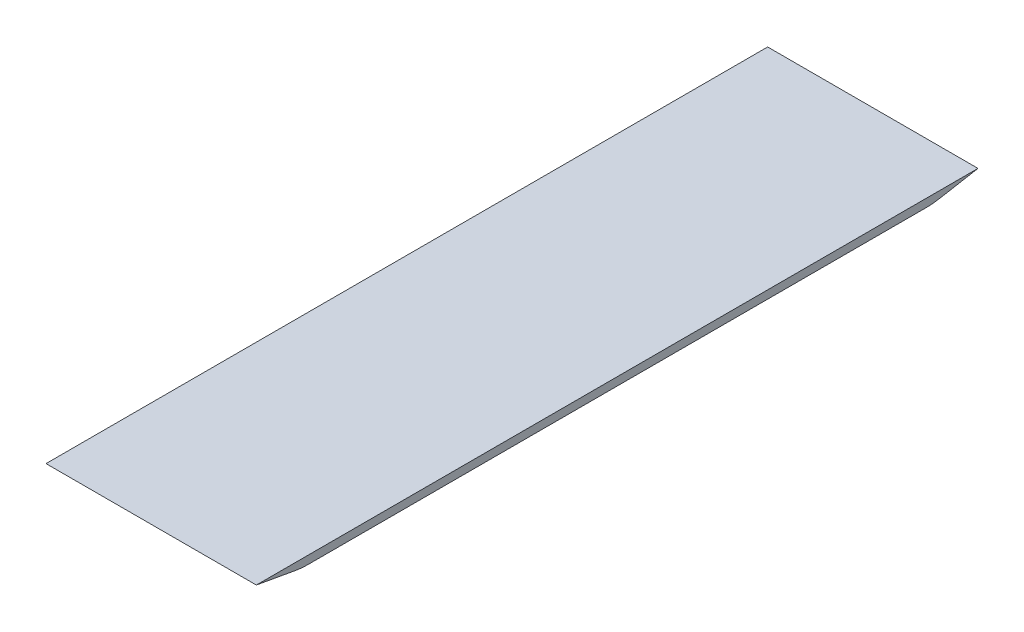
ISO-10303-21;
HEADER;
FILE_DESCRIPTION(('STEP AP214'),'2;1');
FILE_NAME('part.step','',(''),(''),'','','');
FILE_SCHEMA(('AUTOMOTIVE_DESIGN { 1 0 10303 214 1 1 1 1 }'));
ENDSEC;
DATA;
#1=APPLICATION_CONTEXT('core data for automotive mechanical design processes');
#2=APPLICATION_PROTOCOL_DEFINITION('international standard','automotive_design',2000,#1);
#3=PRODUCT_CONTEXT('',#1,'mechanical');
#4=PRODUCT('Part','Part','',(#3));
#5=PRODUCT_RELATED_PRODUCT_CATEGORY('part','',(#4));
#6=PRODUCT_DEFINITION_FORMATION('','',#4);
#7=PRODUCT_DEFINITION_CONTEXT('part definition',#1,'design');
#8=PRODUCT_DEFINITION('design','',#6,#7);
#9=PRODUCT_DEFINITION_SHAPE('','',#8);
#10=(LENGTH_UNIT() NAMED_UNIT(*) SI_UNIT(.MILLI.,.METRE.));
#11=(NAMED_UNIT(*) PLANE_ANGLE_UNIT() SI_UNIT($,.RADIAN.));
#12=(NAMED_UNIT(*) SI_UNIT($,.STERADIAN.) SOLID_ANGLE_UNIT());
#13=UNCERTAINTY_MEASURE_WITH_UNIT(LENGTH_MEASURE(1.E-05),#10,'distance_accuracy_value','');
#14=(GEOMETRIC_REPRESENTATION_CONTEXT(3) GLOBAL_UNCERTAINTY_ASSIGNED_CONTEXT((#13)) GLOBAL_UNIT_ASSIGNED_CONTEXT((#10,
#11,#12)) REPRESENTATION_CONTEXT('',''));
#15=CARTESIAN_POINT('',(0.,0.,0.));
#16=DIRECTION('',(0.,0.,1.));
#17=DIRECTION('',(1.,0.,0.));
#18=AXIS2_PLACEMENT_3D('',#15,#16,#17);
#19=CARTESIAN_POINT('',(130.,0.,-446.));
#20=DIRECTION('',(0.,-0.984427575508482,-0.175790638483657));
#21=DIRECTION('',(0.,0.175790638483657,-0.984427575508482));
#22=AXIS2_PLACEMENT_3D('',#19,#20,#21);
#23=PLANE('',#22);
#24=DIRECTION('',(0.,-0.175790638483657,0.984427575508482));
#25=VECTOR('',#24,1.);
#26=CARTESIAN_POINT('',(130.,0.,-446.));
#27=LINE('',#26,#25);
#28=CARTESIAN_POINT('',(130.,0.,-446.));
#29=VERTEX_POINT('',#28);
#30=CARTESIAN_POINT('',(130.,-4.22137877542409,-422.360278857625));
#31=VERTEX_POINT('',#30);
#32=EDGE_CURVE('E109',#29,#31,#27,.T.);
#33=ORIENTED_EDGE('',*,*,#32,.T.);
#34=DIRECTION('',(-1.,0.,0.));
#35=VECTOR('',#34,1.);
#36=CARTESIAN_POINT('',(130.,-4.22137877542409,-422.360278857625));
#37=LINE('',#36,#35);
#38=CARTESIAN_POINT('',(0.,-4.22137877542409,-422.360278857625));
#39=VERTEX_POINT('',#38);
#40=EDGE_CURVE('E122',#31,#39,#37,.T.);
#41=ORIENTED_EDGE('',*,*,#40,.T.);
#42=DIRECTION('',(0.,-0.175790638483657,0.984427575508482));
#43=VECTOR('',#42,1.);
#44=CARTESIAN_POINT('',(0.,0.,-446.));
#45=LINE('',#44,#43);
#46=CARTESIAN_POINT('',(0.,0.,-446.));
#47=VERTEX_POINT('',#46);
#48=EDGE_CURVE('E113',#47,#39,#45,.T.);
#49=ORIENTED_EDGE('',*,*,#48,.F.);
#50=DIRECTION('',(-1.,0.,0.));
#51=VECTOR('',#50,1.);
#52=CARTESIAN_POINT('',(130.,0.,-446.));
#53=LINE('',#52,#51);
#54=EDGE_CURVE('E104',#29,#47,#53,.T.);
#55=ORIENTED_EDGE('',*,*,#54,.F.);
#56=EDGE_LOOP('',(#33,#41,#49,#55));
#57=FACE_BOUND('',#56,.T.);
#58=ADVANCED_FACE('F39',(#57),#23,.T.);
#59=CARTESIAN_POINT('',(130.,0.,0.));
#60=DIRECTION('',(0.,1.,0.));
#61=DIRECTION('',(0.,0.,1.));
#62=AXIS2_PLACEMENT_3D('',#59,#60,#61);
#63=PLANE('',#62);
#64=DIRECTION('',(0.,0.,-1.));
#65=VECTOR('',#64,1.);
#66=CARTESIAN_POINT('',(0.,0.,0.));
#67=LINE('',#66,#65);
#68=CARTESIAN_POINT('',(0.,0.,0.));
#69=VERTEX_POINT('',#68);
#70=EDGE_CURVE('E103',#69,#47,#67,.T.);
#71=ORIENTED_EDGE('',*,*,#70,.F.);
#72=DIRECTION('',(-1.,0.,0.));
#73=VECTOR('',#72,1.);
#74=CARTESIAN_POINT('',(130.,0.,0.));
#75=LINE('',#74,#73);
#76=CARTESIAN_POINT('',(130.,0.,0.));
#77=VERTEX_POINT('',#76);
#78=EDGE_CURVE('E93',#77,#69,#75,.T.);
#79=ORIENTED_EDGE('',*,*,#78,.F.);
#80=DIRECTION('',(0.,0.,-1.));
#81=VECTOR('',#80,1.);
#82=CARTESIAN_POINT('',(130.,0.,0.));
#83=LINE('',#82,#81);
#84=EDGE_CURVE('E96',#77,#29,#83,.T.);
#85=ORIENTED_EDGE('',*,*,#84,.T.);
#86=ORIENTED_EDGE('',*,*,#54,.T.);
#87=EDGE_LOOP('',(#71,#79,#85,#86));
#88=FACE_BOUND('',#87,.T.);
#89=ADVANCED_FACE('F101',(#88),#63,.T.);
#90=CARTESIAN_POINT('',(130.,-5.00000000000005,-28.));
#91=DIRECTION('',(0.,-0.984427575508482,0.175790638483659));
#92=DIRECTION('',(0.,-0.175790638483659,-0.984427575508482));
#93=AXIS2_PLACEMENT_3D('',#90,#91,#92);
#94=PLANE('',#93);
#95=DIRECTION('',(0.,0.175790638483659,0.984427575508482));
#96=VECTOR('',#95,1.);
#97=CARTESIAN_POINT('',(0.,-5.00000000000005,-28.));
#98=LINE('',#97,#96);
#99=CARTESIAN_POINT('',(0.,-4.22137877542412,-23.6397211423749));
#100=VERTEX_POINT('',#99);
#101=EDGE_CURVE('E119',#100,#69,#98,.T.);
#102=ORIENTED_EDGE('',*,*,#101,.F.);
#103=DIRECTION('',(-1.,0.,0.));
#104=VECTOR('',#103,1.);
#105=CARTESIAN_POINT('',(130.,-4.22137877542412,-23.6397211423749));
#106=LINE('',#105,#104);
#107=CARTESIAN_POINT('',(130.,-4.22137877542412,-23.6397211423749));
#108=VERTEX_POINT('',#107);
#109=EDGE_CURVE('E11',#100,#108,#106,.F.);
#110=ORIENTED_EDGE('',*,*,#109,.T.);
#111=DIRECTION('',(0.,0.175790638483659,0.984427575508482));
#112=VECTOR('',#111,1.);
#113=CARTESIAN_POINT('',(130.,-5.00000000000005,-28.));
#114=LINE('',#113,#112);
#115=EDGE_CURVE('E90',#108,#77,#114,.T.);
#116=ORIENTED_EDGE('',*,*,#115,.T.);
#117=ORIENTED_EDGE('',*,*,#78,.T.);
#118=EDGE_LOOP('',(#102,#110,#116,#117));
#119=FACE_BOUND('',#118,.T.);
#120=ADVANCED_FACE('F92',(#119),#94,.T.);
#121=CARTESIAN_POINT('',(130.,-5.,-418.));
#122=DIRECTION('',(0.,-1.,0.));
#123=DIRECTION('',(0.,0.,-1.));
#124=AXIS2_PLACEMENT_3D('',#121,#122,#123);
#125=PLANE('',#124);
#126=DIRECTION('',(0.,0.,1.));
#127=VECTOR('',#126,1.);
#128=CARTESIAN_POINT('',(0.,-5.,-418.));
#129=LINE('',#128,#127);
#130=CARTESIAN_POINT('',(0.,-5.,-413.570746933442));
#131=VERTEX_POINT('',#130);
#132=CARTESIAN_POINT('',(0.,-5.00000000000005,-32.4292530665578));
#133=VERTEX_POINT('',#132);
#134=EDGE_CURVE('E116',#131,#133,#129,.T.);
#135=ORIENTED_EDGE('',*,*,#134,.F.);
#136=DIRECTION('',(-1.,0.,0.));
#137=VECTOR('',#136,1.);
#138=CARTESIAN_POINT('',(130.,-5.,-413.570746933442));
#139=LINE('',#138,#137);
#140=CARTESIAN_POINT('',(130.,-5.,-413.570746933442));
#141=VERTEX_POINT('',#140);
#142=EDGE_CURVE('E133',#131,#141,#139,.F.);
#143=ORIENTED_EDGE('',*,*,#142,.T.);
#144=DIRECTION('',(0.,0.,1.));
#145=VECTOR('',#144,1.);
#146=CARTESIAN_POINT('',(130.,-5.,-418.));
#147=LINE('',#146,#145);
#148=CARTESIAN_POINT('',(130.,-5.00000000000005,-32.4292530665578));
#149=VERTEX_POINT('',#148);
#150=EDGE_CURVE('E97',#141,#149,#147,.T.);
#151=ORIENTED_EDGE('',*,*,#150,.T.);
#152=DIRECTION('',(-1.,0.,0.));
#153=VECTOR('',#152,1.);
#154=CARTESIAN_POINT('',(130.,-5.00000000000005,-32.4292530665578));
#155=LINE('',#154,#153);
#156=EDGE_CURVE('E130',#149,#133,#155,.T.);
#157=ORIENTED_EDGE('',*,*,#156,.T.);
#158=EDGE_LOOP('',(#135,#143,#151,#157));
#159=FACE_BOUND('',#158,.T.);
#160=ADVANCED_FACE('F147',(#159),#125,.T.);
#161=CARTESIAN_POINT('',(130.,0.,0.));
#162=DIRECTION('',(-1.,0.,0.));
#163=DIRECTION('',(0.,0.,1.));
#164=AXIS2_PLACEMENT_3D('',#161,#162,#163);
#165=PLANE('',#164);
#166=ORIENTED_EDGE('',*,*,#150,.F.);
#167=CARTESIAN_POINT('',(130.,45.,-413.570746933442));
#168=DIRECTION('',(-1.,0.,0.));
#169=DIRECTION('',(0.,0.,1.));
#170=AXIS2_PLACEMENT_3D('',#167,#168,#169);
#171=CIRCLE('',#170,50.);
#172=EDGE_CURVE('E47',#141,#31,#171,.F.);
#173=ORIENTED_EDGE('',*,*,#172,.T.);
#174=ORIENTED_EDGE('',*,*,#32,.F.);
#175=ORIENTED_EDGE('',*,*,#84,.F.);
#176=ORIENTED_EDGE('',*,*,#115,.F.);
#177=CARTESIAN_POINT('',(130.,45.,-32.4292530665578));
#178=DIRECTION('',(-1.,0.,0.));
#179=DIRECTION('',(0.,0.,1.));
#180=AXIS2_PLACEMENT_3D('',#177,#178,#179);
#181=CIRCLE('',#180,50.);
#182=EDGE_CURVE('E59',#108,#149,#181,.F.);
#183=ORIENTED_EDGE('',*,*,#182,.T.);
#184=EDGE_LOOP('',(#166,#173,#174,#175,#176,#183));
#185=FACE_BOUND('',#184,.T.);
#186=ADVANCED_FACE('F107',(#185),#165,.F.);
#187=CARTESIAN_POINT('',(0.,0.,0.));
#188=DIRECTION('',(-1.,0.,0.));
#189=DIRECTION('',(0.,0.,1.));
#190=AXIS2_PLACEMENT_3D('',#187,#188,#189);
#191=PLANE('',#190);
#192=ORIENTED_EDGE('',*,*,#48,.T.);
#193=CARTESIAN_POINT('',(0.,45.,-413.570746933442));
#194=DIRECTION('',(-1.,0.,0.));
#195=DIRECTION('',(0.,0.,1.));
#196=AXIS2_PLACEMENT_3D('',#193,#194,#195);
#197=CIRCLE('',#196,50.);
#198=EDGE_CURVE('E128',#39,#131,#197,.T.);
#199=ORIENTED_EDGE('',*,*,#198,.T.);
#200=ORIENTED_EDGE('',*,*,#134,.T.);
#201=CARTESIAN_POINT('',(0.,45.,-32.4292530665578));
#202=DIRECTION('',(-1.,0.,0.));
#203=DIRECTION('',(0.,0.,1.));
#204=AXIS2_PLACEMENT_3D('',#201,#202,#203);
#205=CIRCLE('',#204,50.);
#206=EDGE_CURVE('E126',#133,#100,#205,.T.);
#207=ORIENTED_EDGE('',*,*,#206,.T.);
#208=ORIENTED_EDGE('',*,*,#101,.T.);
#209=ORIENTED_EDGE('',*,*,#70,.T.);
#210=EDGE_LOOP('',(#192,#199,#200,#207,#208,#209));
#211=FACE_BOUND('',#210,.T.);
#212=ADVANCED_FACE('F145',(#211),#191,.T.);
#213=CARTESIAN_POINT('',(130.,45.,-413.570746933442));
#214=DIRECTION('',(-1.,0.,0.));
#215=DIRECTION('',(0.,0.,1.));
#216=AXIS2_PLACEMENT_3D('',#213,#214,#215);
#217=CYLINDRICAL_SURFACE('',#216,50.);
#218=ORIENTED_EDGE('',*,*,#172,.F.);
#219=ORIENTED_EDGE('',*,*,#142,.F.);
#220=ORIENTED_EDGE('',*,*,#198,.F.);
#221=ORIENTED_EDGE('',*,*,#40,.F.);
#222=EDGE_LOOP('',(#218,#219,#220,#221));
#223=FACE_BOUND('',#222,.T.);
#224=ADVANCED_FACE('F142',(#223),#217,.T.);
#225=CARTESIAN_POINT('',(130.,45.,-32.4292530665578));
#226=DIRECTION('',(-1.,0.,0.));
#227=DIRECTION('',(0.,0.,1.));
#228=AXIS2_PLACEMENT_3D('',#225,#226,#227);
#229=CYLINDRICAL_SURFACE('',#228,50.);
#230=ORIENTED_EDGE('',*,*,#182,.F.);
#231=ORIENTED_EDGE('',*,*,#109,.F.);
#232=ORIENTED_EDGE('',*,*,#206,.F.);
#233=ORIENTED_EDGE('',*,*,#156,.F.);
#234=EDGE_LOOP('',(#230,#231,#232,#233));
#235=FACE_BOUND('',#234,.T.);
#236=ADVANCED_FACE('F41',(#235),#229,.T.);
#237=CLOSED_SHELL('',(#58,#89,#120,#160,#186,#212,#224,#236));
#238=MANIFOLD_SOLID_BREP('B2',#237);
#239=ADVANCED_BREP_SHAPE_REPRESENTATION('',(#18,#238),#14);
#240=SHAPE_DEFINITION_REPRESENTATION(#9,#239);
ENDSEC;
END-ISO-10303-21;
